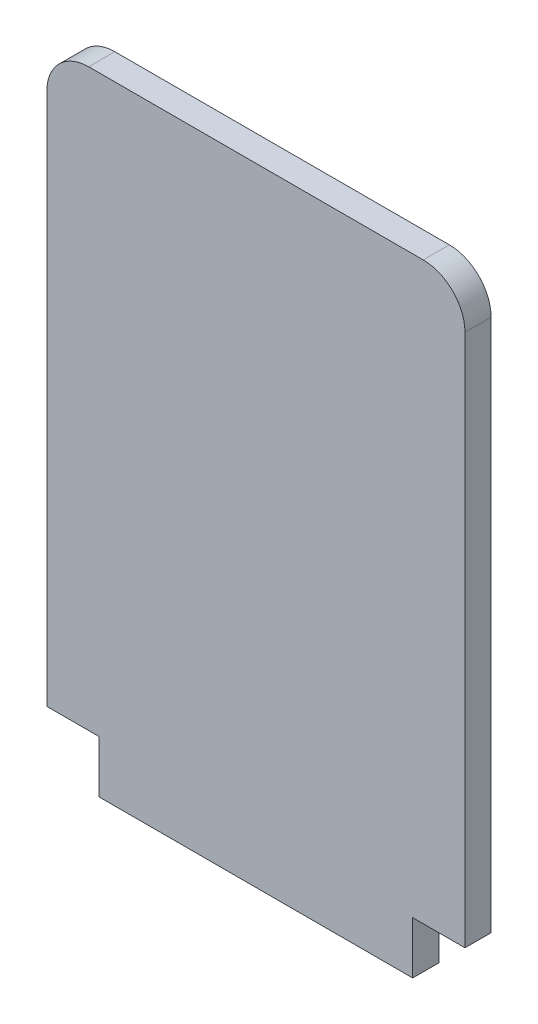
ISO-10303-21;
HEADER;
FILE_DESCRIPTION(('STEP AP214'),'2;1');
FILE_NAME('part.step','',(''),(''),'','','');
FILE_SCHEMA(('AUTOMOTIVE_DESIGN { 1 0 10303 214 1 1 1 1 }'));
ENDSEC;
DATA;
#1=APPLICATION_CONTEXT('core data for automotive mechanical design processes');
#2=APPLICATION_PROTOCOL_DEFINITION('international standard','automotive_design',2000,#1);
#3=PRODUCT_CONTEXT('',#1,'mechanical');
#4=PRODUCT('Part','Part','',(#3));
#5=PRODUCT_RELATED_PRODUCT_CATEGORY('part','',(#4));
#6=PRODUCT_DEFINITION_FORMATION('','',#4);
#7=PRODUCT_DEFINITION_CONTEXT('part definition',#1,'design');
#8=PRODUCT_DEFINITION('design','',#6,#7);
#9=PRODUCT_DEFINITION_SHAPE('','',#8);
#10=(LENGTH_UNIT() NAMED_UNIT(*) SI_UNIT(.MILLI.,.METRE.));
#11=(NAMED_UNIT(*) PLANE_ANGLE_UNIT() SI_UNIT($,.RADIAN.));
#12=(NAMED_UNIT(*) SI_UNIT($,.STERADIAN.) SOLID_ANGLE_UNIT());
#13=UNCERTAINTY_MEASURE_WITH_UNIT(LENGTH_MEASURE(1.E-05),#10,'distance_accuracy_value','');
#14=(GEOMETRIC_REPRESENTATION_CONTEXT(3) GLOBAL_UNCERTAINTY_ASSIGNED_CONTEXT((#13)) GLOBAL_UNIT_ASSIGNED_CONTEXT((#10,
#11,#12)) REPRESENTATION_CONTEXT('',''));
#15=CARTESIAN_POINT('',(0.,0.,0.));
#16=DIRECTION('',(0.,0.,1.));
#17=DIRECTION('',(1.,0.,0.));
#18=AXIS2_PLACEMENT_3D('',#15,#16,#17);
#19=CARTESIAN_POINT('',(0.,0.,6.35));
#20=DIRECTION('',(1.,0.,0.));
#21=DIRECTION('',(0.,0.,-1.));
#22=AXIS2_PLACEMENT_3D('',#19,#20,#21);
#23=PLANE('',#22);
#24=DIRECTION('',(0.,-1.,0.));
#25=VECTOR('',#24,1.);
#26=CARTESIAN_POINT('',(0.,0.,6.35));
#27=LINE('',#26,#25);
#28=CARTESIAN_POINT('',(0.,129.54,6.35));
#29=VERTEX_POINT('',#28);
#30=CARTESIAN_POINT('',(0.,0.,6.35));
#31=VERTEX_POINT('',#30);
#32=EDGE_CURVE('E110',#29,#31,#27,.T.);
#33=ORIENTED_EDGE('',*,*,#32,.F.);
#34=DIRECTION('',(0.,0.,-1.));
#35=VECTOR('',#34,1.);
#36=CARTESIAN_POINT('',(0.,129.54,6.35));
#37=LINE('',#36,#35);
#38=CARTESIAN_POINT('',(0.,129.54,0.));
#39=VERTEX_POINT('',#38);
#40=EDGE_CURVE('E11',#29,#39,#37,.T.);
#41=ORIENTED_EDGE('',*,*,#40,.T.);
#42=DIRECTION('',(0.,-1.,0.));
#43=VECTOR('',#42,1.);
#44=CARTESIAN_POINT('',(0.,0.,0.));
#45=LINE('',#44,#43);
#46=CARTESIAN_POINT('',(0.,0.,0.));
#47=VERTEX_POINT('',#46);
#48=EDGE_CURVE('E130',#39,#47,#45,.T.);
#49=ORIENTED_EDGE('',*,*,#48,.T.);
#50=DIRECTION('',(0.,0.,-1.));
#51=VECTOR('',#50,1.);
#52=CARTESIAN_POINT('',(0.,0.,6.35));
#53=LINE('',#52,#51);
#54=EDGE_CURVE('E123',#31,#47,#53,.T.);
#55=ORIENTED_EDGE('',*,*,#54,.F.);
#56=EDGE_LOOP('',(#33,#41,#49,#55));
#57=FACE_BOUND('',#56,.T.);
#58=ADVANCED_FACE('F33',(#57),#23,.F.);
#59=CARTESIAN_POINT('',(0.,0.,6.35));
#60=DIRECTION('',(0.,1.,0.));
#61=DIRECTION('',(0.,0.,1.));
#62=AXIS2_PLACEMENT_3D('',#59,#60,#61);
#63=PLANE('',#62);
#64=DIRECTION('',(1.,0.,0.));
#65=VECTOR('',#64,1.);
#66=CARTESIAN_POINT('',(0.,0.,0.));
#67=LINE('',#66,#65);
#68=CARTESIAN_POINT('',(12.7,0.,0.));
#69=VERTEX_POINT('',#68);
#70=EDGE_CURVE('E196',#47,#69,#67,.T.);
#71=ORIENTED_EDGE('',*,*,#70,.T.);
#72=DIRECTION('',(0.,0.,-1.));
#73=VECTOR('',#72,1.);
#74=CARTESIAN_POINT('',(12.7,0.,6.35));
#75=LINE('',#74,#73);
#76=CARTESIAN_POINT('',(12.7,0.,6.35));
#77=VERTEX_POINT('',#76);
#78=EDGE_CURVE('E125',#77,#69,#75,.T.);
#79=ORIENTED_EDGE('',*,*,#78,.F.);
#80=DIRECTION('',(1.,0.,0.));
#81=VECTOR('',#80,1.);
#82=CARTESIAN_POINT('',(0.,0.,6.35));
#83=LINE('',#82,#81);
#84=EDGE_CURVE('E113',#31,#77,#83,.T.);
#85=ORIENTED_EDGE('',*,*,#84,.F.);
#86=ORIENTED_EDGE('',*,*,#54,.T.);
#87=EDGE_LOOP('',(#71,#79,#85,#86));
#88=FACE_BOUND('',#87,.T.);
#89=ADVANCED_FACE('F122',(#88),#63,.F.);
#90=CARTESIAN_POINT('',(12.7,0.,6.35));
#91=DIRECTION('',(1.,0.,0.));
#92=DIRECTION('',(0.,1.,0.));
#93=AXIS2_PLACEMENT_3D('',#90,#91,#92);
#94=PLANE('',#93);
#95=DIRECTION('',(0.,-1.,0.));
#96=VECTOR('',#95,1.);
#97=CARTESIAN_POINT('',(12.7,0.,0.));
#98=LINE('',#97,#96);
#99=CARTESIAN_POINT('',(12.7,-12.7,0.));
#100=VERTEX_POINT('',#99);
#101=EDGE_CURVE('E194',#69,#100,#98,.T.);
#102=ORIENTED_EDGE('',*,*,#101,.T.);
#103=DIRECTION('',(0.,0.,-1.));
#104=VECTOR('',#103,1.);
#105=CARTESIAN_POINT('',(12.7,-12.7,6.35));
#106=LINE('',#105,#104);
#107=CARTESIAN_POINT('',(12.7,-12.7,6.35));
#108=VERTEX_POINT('',#107);
#109=EDGE_CURVE('E136',#108,#100,#106,.T.);
#110=ORIENTED_EDGE('',*,*,#109,.F.);
#111=DIRECTION('',(0.,-1.,0.));
#112=VECTOR('',#111,1.);
#113=CARTESIAN_POINT('',(12.7,0.,6.35));
#114=LINE('',#113,#112);
#115=EDGE_CURVE('E127',#77,#108,#114,.T.);
#116=ORIENTED_EDGE('',*,*,#115,.F.);
#117=ORIENTED_EDGE('',*,*,#78,.T.);
#118=EDGE_LOOP('',(#102,#110,#116,#117));
#119=FACE_BOUND('',#118,.T.);
#120=ADVANCED_FACE('F207',(#119),#94,.F.);
#121=CARTESIAN_POINT('',(12.7,-12.7,6.35));
#122=DIRECTION('',(0.,1.,0.));
#123=DIRECTION('',(0.,0.,1.));
#124=AXIS2_PLACEMENT_3D('',#121,#122,#123);
#125=PLANE('',#124);
#126=DIRECTION('',(1.,0.,0.));
#127=VECTOR('',#126,1.);
#128=CARTESIAN_POINT('',(12.7,-12.7,0.));
#129=LINE('',#128,#127);
#130=CARTESIAN_POINT('',(88.9,-12.7,0.));
#131=VERTEX_POINT('',#130);
#132=EDGE_CURVE('E189',#100,#131,#129,.T.);
#133=ORIENTED_EDGE('',*,*,#132,.T.);
#134=DIRECTION('',(0.,0.,-1.));
#135=VECTOR('',#134,1.);
#136=CARTESIAN_POINT('',(88.9,-12.7,6.35));
#137=LINE('',#136,#135);
#138=CARTESIAN_POINT('',(88.9,-12.7,6.35));
#139=VERTEX_POINT('',#138);
#140=EDGE_CURVE('E180',#139,#131,#137,.T.);
#141=ORIENTED_EDGE('',*,*,#140,.F.);
#142=DIRECTION('',(1.,0.,0.));
#143=VECTOR('',#142,1.);
#144=CARTESIAN_POINT('',(12.7,-12.7,6.35));
#145=LINE('',#144,#143);
#146=EDGE_CURVE('E190',#108,#139,#145,.T.);
#147=ORIENTED_EDGE('',*,*,#146,.F.);
#148=ORIENTED_EDGE('',*,*,#109,.T.);
#149=EDGE_LOOP('',(#133,#141,#147,#148));
#150=FACE_BOUND('',#149,.T.);
#151=ADVANCED_FACE('F187',(#150),#125,.F.);
#152=CARTESIAN_POINT('',(88.9,0.,6.35));
#153=DIRECTION('',(-1.,0.,0.));
#154=DIRECTION('',(0.,0.,1.));
#155=AXIS2_PLACEMENT_3D('',#152,#153,#154);
#156=PLANE('',#155);
#157=DIRECTION('',(0.,1.,0.));
#158=VECTOR('',#157,1.);
#159=CARTESIAN_POINT('',(88.9,0.,0.));
#160=LINE('',#159,#158);
#161=CARTESIAN_POINT('',(88.9,0.,0.));
#162=VERTEX_POINT('',#161);
#163=EDGE_CURVE('E172',#131,#162,#160,.T.);
#164=ORIENTED_EDGE('',*,*,#163,.T.);
#165=DIRECTION('',(0.,0.,-1.));
#166=VECTOR('',#165,1.);
#167=CARTESIAN_POINT('',(88.9,0.,6.35));
#168=LINE('',#167,#166);
#169=CARTESIAN_POINT('',(88.9,0.,6.35));
#170=VERTEX_POINT('',#169);
#171=EDGE_CURVE('E177',#170,#162,#168,.T.);
#172=ORIENTED_EDGE('',*,*,#171,.F.);
#173=DIRECTION('',(0.,1.,0.));
#174=VECTOR('',#173,1.);
#175=CARTESIAN_POINT('',(88.9,0.,6.35));
#176=LINE('',#175,#174);
#177=EDGE_CURVE('E204',#139,#170,#176,.T.);
#178=ORIENTED_EDGE('',*,*,#177,.F.);
#179=ORIENTED_EDGE('',*,*,#140,.T.);
#180=EDGE_LOOP('',(#164,#172,#178,#179));
#181=FACE_BOUND('',#180,.T.);
#182=ADVANCED_FACE('F214',(#181),#156,.F.);
#183=CARTESIAN_POINT('',(88.9,0.,6.35));
#184=DIRECTION('',(0.,1.,0.));
#185=DIRECTION('',(0.,0.,1.));
#186=AXIS2_PLACEMENT_3D('',#183,#184,#185);
#187=PLANE('',#186);
#188=DIRECTION('',(1.,0.,0.));
#189=VECTOR('',#188,1.);
#190=CARTESIAN_POINT('',(88.9,0.,0.));
#191=LINE('',#190,#189);
#192=CARTESIAN_POINT('',(101.6,0.,0.));
#193=VERTEX_POINT('',#192);
#194=EDGE_CURVE('E169',#162,#193,#191,.T.);
#195=ORIENTED_EDGE('',*,*,#194,.T.);
#196=DIRECTION('',(0.,0.,-1.));
#197=VECTOR('',#196,1.);
#198=CARTESIAN_POINT('',(101.6,0.,6.35));
#199=LINE('',#198,#197);
#200=CARTESIAN_POINT('',(101.6,0.,6.35));
#201=VERTEX_POINT('',#200);
#202=EDGE_CURVE('E158',#201,#193,#199,.T.);
#203=ORIENTED_EDGE('',*,*,#202,.F.);
#204=DIRECTION('',(1.,0.,0.));
#205=VECTOR('',#204,1.);
#206=CARTESIAN_POINT('',(88.9,0.,6.35));
#207=LINE('',#206,#205);
#208=EDGE_CURVE('E202',#170,#201,#207,.T.);
#209=ORIENTED_EDGE('',*,*,#208,.F.);
#210=ORIENTED_EDGE('',*,*,#171,.T.);
#211=EDGE_LOOP('',(#195,#203,#209,#210));
#212=FACE_BOUND('',#211,.T.);
#213=ADVANCED_FACE('F237',(#212),#187,.F.);
#214=CARTESIAN_POINT('',(101.6,0.,6.35));
#215=DIRECTION('',(-1.,0.,0.));
#216=DIRECTION('',(0.,0.,1.));
#217=AXIS2_PLACEMENT_3D('',#214,#215,#216);
#218=PLANE('',#217);
#219=DIRECTION('',(0.,1.,0.));
#220=VECTOR('',#219,1.);
#221=CARTESIAN_POINT('',(101.6,0.,0.));
#222=LINE('',#221,#220);
#223=CARTESIAN_POINT('',(101.6,129.54,0.));
#224=VERTEX_POINT('',#223);
#225=EDGE_CURVE('E165',#193,#224,#222,.T.);
#226=ORIENTED_EDGE('',*,*,#225,.T.);
#227=DIRECTION('',(0.,0.,-1.));
#228=VECTOR('',#227,1.);
#229=CARTESIAN_POINT('',(101.6,129.54,6.35));
#230=LINE('',#229,#228);
#231=CARTESIAN_POINT('',(101.6,129.54,6.35));
#232=VERTEX_POINT('',#231);
#233=EDGE_CURVE('E56',#224,#232,#230,.F.);
#234=ORIENTED_EDGE('',*,*,#233,.T.);
#235=DIRECTION('',(0.,1.,0.));
#236=VECTOR('',#235,1.);
#237=CARTESIAN_POINT('',(101.6,0.,6.35));
#238=LINE('',#237,#236);
#239=EDGE_CURVE('E150',#201,#232,#238,.T.);
#240=ORIENTED_EDGE('',*,*,#239,.F.);
#241=ORIENTED_EDGE('',*,*,#202,.T.);
#242=EDGE_LOOP('',(#226,#234,#240,#241));
#243=FACE_BOUND('',#242,.T.);
#244=ADVANCED_FACE('F167',(#243),#218,.F.);
#245=CARTESIAN_POINT('',(0.,139.7,6.35));
#246=DIRECTION('',(0.,-1.,0.));
#247=DIRECTION('',(0.,0.,-1.));
#248=AXIS2_PLACEMENT_3D('',#245,#246,#247);
#249=PLANE('',#248);
#250=DIRECTION('',(-1.,0.,0.));
#251=VECTOR('',#250,1.);
#252=CARTESIAN_POINT('',(0.,139.7,6.35));
#253=LINE('',#252,#251);
#254=CARTESIAN_POINT('',(91.44,139.7,6.35));
#255=VERTEX_POINT('',#254);
#256=CARTESIAN_POINT('',(10.16,139.7,6.35));
#257=VERTEX_POINT('',#256);
#258=EDGE_CURVE('E149',#255,#257,#253,.T.);
#259=ORIENTED_EDGE('',*,*,#258,.F.);
#260=DIRECTION('',(0.,0.,-1.));
#261=VECTOR('',#260,1.);
#262=CARTESIAN_POINT('',(91.44,139.7,6.35));
#263=LINE('',#262,#261);
#264=CARTESIAN_POINT('',(91.44,139.7,0.));
#265=VERTEX_POINT('',#264);
#266=EDGE_CURVE('E134',#255,#265,#263,.T.);
#267=ORIENTED_EDGE('',*,*,#266,.T.);
#268=DIRECTION('',(-1.,0.,0.));
#269=VECTOR('',#268,1.);
#270=CARTESIAN_POINT('',(0.,139.7,0.));
#271=LINE('',#270,#269);
#272=CARTESIAN_POINT('',(10.16,139.7,0.));
#273=VERTEX_POINT('',#272);
#274=EDGE_CURVE('E118',#265,#273,#271,.T.);
#275=ORIENTED_EDGE('',*,*,#274,.T.);
#276=DIRECTION('',(0.,0.,-1.));
#277=VECTOR('',#276,1.);
#278=CARTESIAN_POINT('',(10.16,139.7,6.35));
#279=LINE('',#278,#277);
#280=EDGE_CURVE('E132',#273,#257,#279,.F.);
#281=ORIENTED_EDGE('',*,*,#280,.T.);
#282=EDGE_LOOP('',(#259,#267,#275,#281));
#283=FACE_BOUND('',#282,.T.);
#284=ADVANCED_FACE('F154',(#283),#249,.F.);
#285=CARTESIAN_POINT('',(0.,0.,6.35));
#286=DIRECTION('',(0.,0.,-1.));
#287=DIRECTION('',(-1.,0.,0.));
#288=AXIS2_PLACEMENT_3D('',#285,#286,#287);
#289=PLANE('',#288);
#290=ORIENTED_EDGE('',*,*,#239,.T.);
#291=CARTESIAN_POINT('',(91.44,129.54,6.35));
#292=DIRECTION('',(0.,0.,-1.));
#293=DIRECTION('',(-1.,0.,0.));
#294=AXIS2_PLACEMENT_3D('',#291,#292,#293);
#295=CIRCLE('',#294,10.16);
#296=EDGE_CURVE('E41',#232,#255,#295,.F.);
#297=ORIENTED_EDGE('',*,*,#296,.T.);
#298=ORIENTED_EDGE('',*,*,#258,.T.);
#299=CARTESIAN_POINT('',(10.16,129.54,6.35));
#300=DIRECTION('',(0.,0.,-1.));
#301=DIRECTION('',(-1.,0.,0.));
#302=AXIS2_PLACEMENT_3D('',#299,#300,#301);
#303=CIRCLE('',#302,10.16);
#304=EDGE_CURVE('E48',#257,#29,#303,.F.);
#305=ORIENTED_EDGE('',*,*,#304,.T.);
#306=ORIENTED_EDGE('',*,*,#32,.T.);
#307=ORIENTED_EDGE('',*,*,#84,.T.);
#308=ORIENTED_EDGE('',*,*,#115,.T.);
#309=ORIENTED_EDGE('',*,*,#146,.T.);
#310=ORIENTED_EDGE('',*,*,#177,.T.);
#311=ORIENTED_EDGE('',*,*,#208,.T.);
#312=EDGE_LOOP('',(#290,#297,#298,#305,#306,#307,#308,#309,#310,#311));
#313=FACE_BOUND('',#312,.T.);
#314=ADVANCED_FACE('F112',(#313),#289,.F.);
#315=CARTESIAN_POINT('',(0.,0.,0.));
#316=DIRECTION('',(0.,0.,-1.));
#317=DIRECTION('',(-1.,0.,0.));
#318=AXIS2_PLACEMENT_3D('',#315,#316,#317);
#319=PLANE('',#318);
#320=ORIENTED_EDGE('',*,*,#274,.F.);
#321=CARTESIAN_POINT('',(91.44,129.54,0.));
#322=DIRECTION('',(0.,0.,-1.));
#323=DIRECTION('',(-1.,0.,0.));
#324=AXIS2_PLACEMENT_3D('',#321,#322,#323);
#325=CIRCLE('',#324,10.16);
#326=EDGE_CURVE('E144',#265,#224,#325,.T.);
#327=ORIENTED_EDGE('',*,*,#326,.T.);
#328=ORIENTED_EDGE('',*,*,#225,.F.);
#329=ORIENTED_EDGE('',*,*,#194,.F.);
#330=ORIENTED_EDGE('',*,*,#163,.F.);
#331=ORIENTED_EDGE('',*,*,#132,.F.);
#332=ORIENTED_EDGE('',*,*,#101,.F.);
#333=ORIENTED_EDGE('',*,*,#70,.F.);
#334=ORIENTED_EDGE('',*,*,#48,.F.);
#335=CARTESIAN_POINT('',(10.16,129.54,0.));
#336=DIRECTION('',(0.,0.,-1.));
#337=DIRECTION('',(-1.,0.,0.));
#338=AXIS2_PLACEMENT_3D('',#335,#336,#337);
#339=CIRCLE('',#338,10.16);
#340=EDGE_CURVE('E142',#39,#273,#339,.T.);
#341=ORIENTED_EDGE('',*,*,#340,.T.);
#342=EDGE_LOOP('',(#320,#327,#328,#329,#330,#331,#332,#333,#334,#341));
#343=FACE_BOUND('',#342,.T.);
#344=ADVANCED_FACE('F163',(#343),#319,.T.);
#345=CARTESIAN_POINT('',(91.44,129.54,6.35));
#346=DIRECTION('',(0.,0.,-1.));
#347=DIRECTION('',(-1.,0.,0.));
#348=AXIS2_PLACEMENT_3D('',#345,#346,#347);
#349=CYLINDRICAL_SURFACE('',#348,10.16);
#350=ORIENTED_EDGE('',*,*,#296,.F.);
#351=ORIENTED_EDGE('',*,*,#233,.F.);
#352=ORIENTED_EDGE('',*,*,#326,.F.);
#353=ORIENTED_EDGE('',*,*,#266,.F.);
#354=EDGE_LOOP('',(#350,#351,#352,#353));
#355=FACE_BOUND('',#354,.T.);
#356=ADVANCED_FACE('F160',(#355),#349,.T.);
#357=CARTESIAN_POINT('',(10.16,129.54,6.35));
#358=DIRECTION('',(0.,0.,-1.));
#359=DIRECTION('',(-1.,0.,0.));
#360=AXIS2_PLACEMENT_3D('',#357,#358,#359);
#361=CYLINDRICAL_SURFACE('',#360,10.16);
#362=ORIENTED_EDGE('',*,*,#304,.F.);
#363=ORIENTED_EDGE('',*,*,#280,.F.);
#364=ORIENTED_EDGE('',*,*,#340,.F.);
#365=ORIENTED_EDGE('',*,*,#40,.F.);
#366=EDGE_LOOP('',(#362,#363,#364,#365));
#367=FACE_BOUND('',#366,.T.);
#368=ADVANCED_FACE('F35',(#367),#361,.T.);
#369=CLOSED_SHELL('',(#58,#89,#120,#151,#182,#213,#244,#284,#314,#344,#356,#368));
#370=MANIFOLD_SOLID_BREP('B2',#369);
#371=ADVANCED_BREP_SHAPE_REPRESENTATION('',(#18,#370),#14);
#372=SHAPE_DEFINITION_REPRESENTATION(#9,#371);
ENDSEC;
END-ISO-10303-21;
